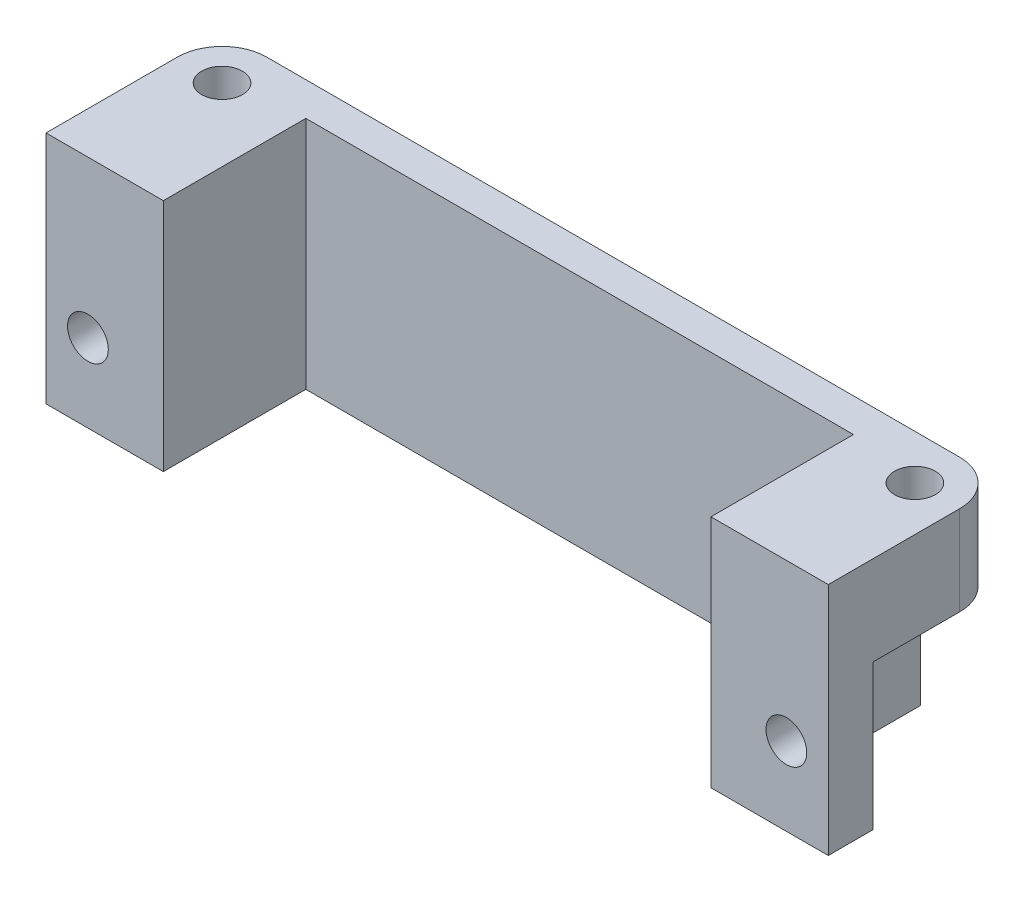
ISO-10303-21;
HEADER;
FILE_DESCRIPTION(('STEP AP214'),'2;1');
FILE_NAME('part.step','',(''),(''),'','','');
FILE_SCHEMA(('AUTOMOTIVE_DESIGN { 1 0 10303 214 1 1 1 1 }'));
ENDSEC;
DATA;
#1=APPLICATION_CONTEXT('core data for automotive mechanical design processes');
#2=APPLICATION_PROTOCOL_DEFINITION('international standard','automotive_design',2000,#1);
#3=PRODUCT_CONTEXT('',#1,'mechanical');
#4=PRODUCT('Part','Part','',(#3));
#5=PRODUCT_RELATED_PRODUCT_CATEGORY('part','',(#4));
#6=PRODUCT_DEFINITION_FORMATION('','',#4);
#7=PRODUCT_DEFINITION_CONTEXT('part definition',#1,'design');
#8=PRODUCT_DEFINITION('design','',#6,#7);
#9=PRODUCT_DEFINITION_SHAPE('','',#8);
#10=(LENGTH_UNIT() NAMED_UNIT(*) SI_UNIT(.MILLI.,.METRE.));
#11=(NAMED_UNIT(*) PLANE_ANGLE_UNIT() SI_UNIT($,.RADIAN.));
#12=(NAMED_UNIT(*) SI_UNIT($,.STERADIAN.) SOLID_ANGLE_UNIT());
#13=UNCERTAINTY_MEASURE_WITH_UNIT(LENGTH_MEASURE(1.E-05),#10,'distance_accuracy_value','');
#14=(GEOMETRIC_REPRESENTATION_CONTEXT(3) GLOBAL_UNCERTAINTY_ASSIGNED_CONTEXT((#13)) GLOBAL_UNIT_ASSIGNED_CONTEXT((#10,
#11,#12)) REPRESENTATION_CONTEXT('',''));
#15=CARTESIAN_POINT('',(0.,0.,0.));
#16=DIRECTION('',(0.,0.,1.));
#17=DIRECTION('',(1.,0.,0.));
#18=AXIS2_PLACEMENT_3D('',#15,#16,#17);
#19=CARTESIAN_POINT('',(0.,21.,-15.75));
#20=DIRECTION('',(0.,0.,1.));
#21=DIRECTION('',(1.,0.,0.));
#22=AXIS2_PLACEMENT_3D('',#19,#20,#21);
#23=PLANE('',#22);
#24=DIRECTION('',(-1.,0.,0.));
#25=VECTOR('',#24,1.);
#26=CARTESIAN_POINT('',(0.,21.,-15.75));
#27=LINE('',#26,#25);
#28=CARTESIAN_POINT('',(31.,21.,-15.75));
#29=VERTEX_POINT('',#28);
#30=CARTESIAN_POINT('',(-31.,21.,-15.75));
#31=VERTEX_POINT('',#30);
#32=EDGE_CURVE('E249',#29,#31,#27,.T.);
#33=ORIENTED_EDGE('',*,*,#32,.F.);
#34=DIRECTION('',(0.,-1.,0.));
#35=VECTOR('',#34,1.);
#36=CARTESIAN_POINT('',(31.,21.,-15.75));
#37=LINE('',#36,#35);
#38=CARTESIAN_POINT('',(31.,13.,-15.7500000000001));
#39=VERTEX_POINT('',#38);
#40=EDGE_CURVE('E279',#29,#39,#37,.T.);
#41=ORIENTED_EDGE('',*,*,#40,.T.);
#42=DIRECTION('',(-1.,0.,0.));
#43=VECTOR('',#42,1.);
#44=CARTESIAN_POINT('',(35.,13.,-15.7500000000001));
#45=LINE('',#44,#43);
#46=CARTESIAN_POINT('',(27.5,13.,-15.7500000000001));
#47=VERTEX_POINT('',#46);
#48=EDGE_CURVE('E167',#39,#47,#45,.T.);
#49=ORIENTED_EDGE('',*,*,#48,.T.);
#50=DIRECTION('',(0.,-1.,0.));
#51=VECTOR('',#50,1.);
#52=CARTESIAN_POINT('',(27.5,13.,-15.7500000000001));
#53=LINE('',#52,#51);
#54=CARTESIAN_POINT('',(27.5,0.,-15.7500000000001));
#55=VERTEX_POINT('',#54);
#56=EDGE_CURVE('E169',#47,#55,#53,.T.);
#57=ORIENTED_EDGE('',*,*,#56,.T.);
#58=DIRECTION('',(-1.,0.,0.));
#59=VECTOR('',#58,1.);
#60=CARTESIAN_POINT('',(0.,0.,-15.75));
#61=LINE('',#60,#59);
#62=CARTESIAN_POINT('',(-27.5,0.,-15.75));
#63=VERTEX_POINT('',#62);
#64=EDGE_CURVE('E241',#55,#63,#61,.T.);
#65=ORIENTED_EDGE('',*,*,#64,.T.);
#66=DIRECTION('',(0.,-1.,0.));
#67=VECTOR('',#66,1.);
#68=CARTESIAN_POINT('',(-27.5,13.,-15.75));
#69=LINE('',#68,#67);
#70=CARTESIAN_POINT('',(-27.5,13.,-15.75));
#71=VERTEX_POINT('',#70);
#72=EDGE_CURVE('E219',#71,#63,#69,.T.);
#73=ORIENTED_EDGE('',*,*,#72,.F.);
#74=DIRECTION('',(1.,0.,0.));
#75=VECTOR('',#74,1.);
#76=CARTESIAN_POINT('',(-35.,13.,-15.75));
#77=LINE('',#76,#75);
#78=CARTESIAN_POINT('',(-31.,13.,-15.75));
#79=VERTEX_POINT('',#78);
#80=EDGE_CURVE('E210',#79,#71,#77,.T.);
#81=ORIENTED_EDGE('',*,*,#80,.F.);
#82=DIRECTION('',(0.,-1.,0.));
#83=VECTOR('',#82,1.);
#84=CARTESIAN_POINT('',(-31.,21.,-15.75));
#85=LINE('',#84,#83);
#86=EDGE_CURVE('E274',#79,#31,#85,.F.);
#87=ORIENTED_EDGE('',*,*,#86,.T.);
#88=EDGE_LOOP('',(#33,#41,#49,#57,#65,#73,#81,#87));
#89=FACE_BOUND('',#88,.T.);
#90=ADVANCED_FACE('F35',(#89),#23,.F.);
#91=CARTESIAN_POINT('',(0.,0.,0.));
#92=DIRECTION('',(0.,1.,0.));
#93=DIRECTION('',(0.,0.,1.));
#94=AXIS2_PLACEMENT_3D('',#91,#92,#93);
#95=PLANE('',#94);
#96=DIRECTION('',(0.,0.,1.));
#97=VECTOR('',#96,1.);
#98=CARTESIAN_POINT('',(27.5,0.,-15.7500000000001));
#99=LINE('',#98,#97);
#100=CARTESIAN_POINT('',(27.5,0.,-4.00000000000006));
#101=VERTEX_POINT('',#100);
#102=EDGE_CURVE('E160',#55,#101,#99,.T.);
#103=ORIENTED_EDGE('',*,*,#102,.T.);
#104=DIRECTION('',(1.,0.,0.));
#105=VECTOR('',#104,1.);
#106=CARTESIAN_POINT('',(35.,0.,-4.00000000000008));
#107=LINE('',#106,#105);
#108=CARTESIAN_POINT('',(35.,0.,-4.00000000000008));
#109=VERTEX_POINT('',#108);
#110=EDGE_CURVE('E292',#101,#109,#107,.T.);
#111=ORIENTED_EDGE('',*,*,#110,.T.);
#112=DIRECTION('',(0.,0.,-1.));
#113=VECTOR('',#112,1.);
#114=CARTESIAN_POINT('',(35.,0.,0.));
#115=LINE('',#114,#113);
#116=CARTESIAN_POINT('',(35.,0.,0.));
#117=VERTEX_POINT('',#116);
#118=EDGE_CURVE('E166',#117,#109,#115,.T.);
#119=ORIENTED_EDGE('',*,*,#118,.F.);
#120=DIRECTION('',(1.,0.,0.));
#121=VECTOR('',#120,1.);
#122=CARTESIAN_POINT('',(0.,0.,0.));
#123=LINE('',#122,#121);
#124=CARTESIAN_POINT('',(24.5,0.,0.));
#125=VERTEX_POINT('',#124);
#126=EDGE_CURVE('E183',#125,#117,#123,.T.);
#127=ORIENTED_EDGE('',*,*,#126,.F.);
#128=DIRECTION('',(0.,0.,-1.));
#129=VECTOR('',#128,1.);
#130=CARTESIAN_POINT('',(24.5,0.,0.));
#131=LINE('',#130,#129);
#132=CARTESIAN_POINT('',(24.5,0.,-12.7500000000001));
#133=VERTEX_POINT('',#132);
#134=EDGE_CURVE('E190',#125,#133,#131,.T.);
#135=ORIENTED_EDGE('',*,*,#134,.T.);
#136=DIRECTION('',(-1.,0.,0.));
#137=VECTOR('',#136,1.);
#138=CARTESIAN_POINT('',(0.,0.,-12.75));
#139=LINE('',#138,#137);
#140=CARTESIAN_POINT('',(-24.5,0.,-12.75));
#141=VERTEX_POINT('',#140);
#142=EDGE_CURVE('E260',#133,#141,#139,.T.);
#143=ORIENTED_EDGE('',*,*,#142,.T.);
#144=DIRECTION('',(0.,0.,-1.));
#145=VECTOR('',#144,1.);
#146=CARTESIAN_POINT('',(-24.5,0.,0.));
#147=LINE('',#146,#145);
#148=CARTESIAN_POINT('',(-24.5,0.,0.));
#149=VERTEX_POINT('',#148);
#150=EDGE_CURVE('E257',#149,#141,#147,.T.);
#151=ORIENTED_EDGE('',*,*,#150,.F.);
#152=DIRECTION('',(-1.,0.,0.));
#153=VECTOR('',#152,1.);
#154=CARTESIAN_POINT('',(0.,0.,0.));
#155=LINE('',#154,#153);
#156=CARTESIAN_POINT('',(-35.,0.,0.));
#157=VERTEX_POINT('',#156);
#158=EDGE_CURVE('E254',#149,#157,#155,.T.);
#159=ORIENTED_EDGE('',*,*,#158,.T.);
#160=DIRECTION('',(0.,0.,-1.));
#161=VECTOR('',#160,1.);
#162=CARTESIAN_POINT('',(-35.,0.,0.));
#163=LINE('',#162,#161);
#164=CARTESIAN_POINT('',(-35.,0.,-4.));
#165=VERTEX_POINT('',#164);
#166=EDGE_CURVE('E236',#157,#165,#163,.T.);
#167=ORIENTED_EDGE('',*,*,#166,.T.);
#168=DIRECTION('',(-1.,0.,0.));
#169=VECTOR('',#168,1.);
#170=CARTESIAN_POINT('',(-35.,0.,-4.));
#171=LINE('',#170,#169);
#172=CARTESIAN_POINT('',(-27.5,0.,-4.));
#173=VERTEX_POINT('',#172);
#174=EDGE_CURVE('E211',#173,#165,#171,.T.);
#175=ORIENTED_EDGE('',*,*,#174,.F.);
#176=DIRECTION('',(0.,0.,1.));
#177=VECTOR('',#176,1.);
#178=CARTESIAN_POINT('',(-27.5,0.,-15.75));
#179=LINE('',#178,#177);
#180=EDGE_CURVE('E204',#63,#173,#179,.T.);
#181=ORIENTED_EDGE('',*,*,#180,.F.);
#182=ORIENTED_EDGE('',*,*,#64,.F.);
#183=EDGE_LOOP('',(#103,#111,#119,#127,#135,#143,#151,#159,#167,#175,#181,#182));
#184=FACE_BOUND('',#183,.T.);
#185=ADVANCED_FACE('F300',(#184),#95,.F.);
#186=CARTESIAN_POINT('',(35.,21.,0.));
#187=DIRECTION('',(-1.,0.,0.));
#188=DIRECTION('',(0.,0.,1.));
#189=AXIS2_PLACEMENT_3D('',#186,#187,#188);
#190=PLANE('',#189);
#191=DIRECTION('',(0.,0.,-1.));
#192=VECTOR('',#191,1.);
#193=CARTESIAN_POINT('',(35.,13.,-15.7500000000001));
#194=LINE('',#193,#192);
#195=CARTESIAN_POINT('',(35.,13.,-4.00000000000008));
#196=VERTEX_POINT('',#195);
#197=CARTESIAN_POINT('',(35.,13.,-11.75));
#198=VERTEX_POINT('',#197);
#199=EDGE_CURVE('E157',#196,#198,#194,.T.);
#200=ORIENTED_EDGE('',*,*,#199,.T.);
#201=DIRECTION('',(0.,-1.,0.));
#202=VECTOR('',#201,1.);
#203=CARTESIAN_POINT('',(35.,21.,-11.75));
#204=LINE('',#203,#202);
#205=CARTESIAN_POINT('',(35.,21.,-11.75));
#206=VERTEX_POINT('',#205);
#207=EDGE_CURVE('E43',#198,#206,#204,.F.);
#208=ORIENTED_EDGE('',*,*,#207,.T.);
#209=DIRECTION('',(0.,0.,-1.));
#210=VECTOR('',#209,1.);
#211=CARTESIAN_POINT('',(35.,21.,0.));
#212=LINE('',#211,#210);
#213=CARTESIAN_POINT('',(35.,21.,0.));
#214=VERTEX_POINT('',#213);
#215=EDGE_CURVE('E180',#214,#206,#212,.T.);
#216=ORIENTED_EDGE('',*,*,#215,.F.);
#217=DIRECTION('',(0.,-1.,0.));
#218=VECTOR('',#217,1.);
#219=CARTESIAN_POINT('',(35.,21.,0.));
#220=LINE('',#219,#218);
#221=EDGE_CURVE('E188',#214,#117,#220,.T.);
#222=ORIENTED_EDGE('',*,*,#221,.T.);
#223=ORIENTED_EDGE('',*,*,#118,.T.);
#224=DIRECTION('',(0.,-1.,0.));
#225=VECTOR('',#224,1.);
#226=CARTESIAN_POINT('',(35.,13.,-4.00000000000008));
#227=LINE('',#226,#225);
#228=EDGE_CURVE('E152',#196,#109,#227,.T.);
#229=ORIENTED_EDGE('',*,*,#228,.F.);
#230=EDGE_LOOP('',(#200,#208,#216,#222,#223,#229));
#231=FACE_BOUND('',#230,.T.);
#232=ADVANCED_FACE('F163',(#231),#190,.F.);
#233=CARTESIAN_POINT('',(-35.,21.,0.));
#234=DIRECTION('',(-1.,0.,0.));
#235=DIRECTION('',(0.,0.,1.));
#236=AXIS2_PLACEMENT_3D('',#233,#234,#235);
#237=PLANE('',#236);
#238=DIRECTION('',(0.,0.,-1.));
#239=VECTOR('',#238,1.);
#240=CARTESIAN_POINT('',(-35.,21.,0.));
#241=LINE('',#240,#239);
#242=CARTESIAN_POINT('',(-35.,21.,0.));
#243=VERTEX_POINT('',#242);
#244=CARTESIAN_POINT('',(-35.,21.,-11.75));
#245=VERTEX_POINT('',#244);
#246=EDGE_CURVE('E237',#243,#245,#241,.T.);
#247=ORIENTED_EDGE('',*,*,#246,.T.);
#248=DIRECTION('',(0.,-1.,0.));
#249=VECTOR('',#248,1.);
#250=CARTESIAN_POINT('',(-35.,13.,-11.75));
#251=LINE('',#250,#249);
#252=CARTESIAN_POINT('',(-35.,13.,-11.75));
#253=VERTEX_POINT('',#252);
#254=EDGE_CURVE('E269',#245,#253,#251,.T.);
#255=ORIENTED_EDGE('',*,*,#254,.T.);
#256=DIRECTION('',(0.,0.,-1.));
#257=VECTOR('',#256,1.);
#258=CARTESIAN_POINT('',(-35.,13.,-15.75));
#259=LINE('',#258,#257);
#260=CARTESIAN_POINT('',(-35.,13.,-4.));
#261=VERTEX_POINT('',#260);
#262=EDGE_CURVE('E207',#261,#253,#259,.T.);
#263=ORIENTED_EDGE('',*,*,#262,.F.);
#264=DIRECTION('',(0.,-1.,0.));
#265=VECTOR('',#264,1.);
#266=CARTESIAN_POINT('',(-35.,13.,-4.));
#267=LINE('',#266,#265);
#268=EDGE_CURVE('E223',#261,#165,#267,.T.);
#269=ORIENTED_EDGE('',*,*,#268,.T.);
#270=ORIENTED_EDGE('',*,*,#166,.F.);
#271=DIRECTION('',(0.,-1.,0.));
#272=VECTOR('',#271,1.);
#273=CARTESIAN_POINT('',(-35.,21.,0.));
#274=LINE('',#273,#272);
#275=EDGE_CURVE('E267',#243,#157,#274,.T.);
#276=ORIENTED_EDGE('',*,*,#275,.F.);
#277=EDGE_LOOP('',(#247,#255,#263,#269,#270,#276));
#278=FACE_BOUND('',#277,.T.);
#279=ADVANCED_FACE('F317',(#278),#237,.T.);
#280=CARTESIAN_POINT('',(0.,21.,0.));
#281=DIRECTION('',(0.,0.,1.));
#282=DIRECTION('',(1.,0.,0.));
#283=AXIS2_PLACEMENT_3D('',#280,#281,#282);
#284=PLANE('',#283);
#285=CARTESIAN_POINT('',(-31.25,7.,0.));
#286=DIRECTION('',(0.,0.,1.));
#287=DIRECTION('',(1.,0.,0.));
#288=AXIS2_PLACEMENT_3D('',#285,#286,#287);
#289=CIRCLE('',#288,1.825);
#290=CARTESIAN_POINT('',(-29.425,7.,0.));
#291=VERTEX_POINT('',#290);
#292=EDGE_CURVE('E233',#291,#291,#289,.T.);
#293=ORIENTED_EDGE('',*,*,#292,.F.);
#294=EDGE_LOOP('',(#293));
#295=FACE_BOUND('',#294,.T.);
#296=ORIENTED_EDGE('',*,*,#158,.F.);
#297=DIRECTION('',(0.,-1.,0.));
#298=VECTOR('',#297,1.);
#299=CARTESIAN_POINT('',(-24.5,21.,0.));
#300=LINE('',#299,#298);
#301=CARTESIAN_POINT('',(-24.5,21.,0.));
#302=VERTEX_POINT('',#301);
#303=EDGE_CURVE('E265',#302,#149,#300,.T.);
#304=ORIENTED_EDGE('',*,*,#303,.F.);
#305=DIRECTION('',(-1.,0.,0.));
#306=VECTOR('',#305,1.);
#307=CARTESIAN_POINT('',(0.,21.,0.));
#308=LINE('',#307,#306);
#309=EDGE_CURVE('E240',#302,#243,#308,.T.);
#310=ORIENTED_EDGE('',*,*,#309,.T.);
#311=ORIENTED_EDGE('',*,*,#275,.T.);
#312=EDGE_LOOP('',(#296,#304,#310,#311));
#313=FACE_BOUND('',#312,.T.);
#314=ADVANCED_FACE('F322',(#295,#313),#284,.T.);
#315=CARTESIAN_POINT('',(-24.5,21.,0.));
#316=DIRECTION('',(-1.,0.,0.));
#317=DIRECTION('',(0.,0.,1.));
#318=AXIS2_PLACEMENT_3D('',#315,#316,#317);
#319=PLANE('',#318);
#320=ORIENTED_EDGE('',*,*,#150,.T.);
#321=DIRECTION('',(0.,-1.,0.));
#322=VECTOR('',#321,1.);
#323=CARTESIAN_POINT('',(-24.5,21.,-12.75));
#324=LINE('',#323,#322);
#325=CARTESIAN_POINT('',(-24.5,21.,-12.75));
#326=VERTEX_POINT('',#325);
#327=EDGE_CURVE('E251',#326,#141,#324,.T.);
#328=ORIENTED_EDGE('',*,*,#327,.F.);
#329=DIRECTION('',(0.,0.,-1.));
#330=VECTOR('',#329,1.);
#331=CARTESIAN_POINT('',(-24.5,21.,0.));
#332=LINE('',#331,#330);
#333=EDGE_CURVE('E244',#302,#326,#332,.T.);
#334=ORIENTED_EDGE('',*,*,#333,.F.);
#335=ORIENTED_EDGE('',*,*,#303,.T.);
#336=EDGE_LOOP('',(#320,#328,#334,#335));
#337=FACE_BOUND('',#336,.T.);
#338=ADVANCED_FACE('F328',(#337),#319,.F.);
#339=CARTESIAN_POINT('',(0.,21.,-12.75));
#340=DIRECTION('',(0.,0.,1.));
#341=DIRECTION('',(1.,0.,0.));
#342=AXIS2_PLACEMENT_3D('',#339,#340,#341);
#343=PLANE('',#342);
#344=ORIENTED_EDGE('',*,*,#142,.F.);
#345=DIRECTION('',(0.,-1.,0.));
#346=VECTOR('',#345,1.);
#347=CARTESIAN_POINT('',(24.5,21.,-12.7500000000001));
#348=LINE('',#347,#346);
#349=CARTESIAN_POINT('',(24.5,21.,-12.7500000000001));
#350=VERTEX_POINT('',#349);
#351=EDGE_CURVE('E197',#350,#133,#348,.T.);
#352=ORIENTED_EDGE('',*,*,#351,.F.);
#353=DIRECTION('',(-1.,0.,0.));
#354=VECTOR('',#353,1.);
#355=CARTESIAN_POINT('',(0.,21.,-12.75));
#356=LINE('',#355,#354);
#357=EDGE_CURVE('E246',#350,#326,#356,.T.);
#358=ORIENTED_EDGE('',*,*,#357,.T.);
#359=ORIENTED_EDGE('',*,*,#327,.T.);
#360=EDGE_LOOP('',(#344,#352,#358,#359));
#361=FACE_BOUND('',#360,.T.);
#362=ADVANCED_FACE('F331',(#361),#343,.T.);
#363=CARTESIAN_POINT('',(0.,21.,0.));
#364=DIRECTION('',(0.,1.,0.));
#365=DIRECTION('',(0.,0.,1.));
#366=AXIS2_PLACEMENT_3D('',#363,#364,#365);
#367=PLANE('',#366);
#368=CARTESIAN_POINT('',(31.,21.,-11.7500000000001));
#369=DIRECTION('',(0.,1.,0.));
#370=DIRECTION('',(0.,0.,-1.));
#371=AXIS2_PLACEMENT_3D('',#368,#369,#370);
#372=CIRCLE('',#371,1.825);
#373=CARTESIAN_POINT('',(31.,21.,-13.5750000000001));
#374=VERTEX_POINT('',#373);
#375=EDGE_CURVE('E294',#374,#374,#372,.T.);
#376=ORIENTED_EDGE('',*,*,#375,.F.);
#377=EDGE_LOOP('',(#376));
#378=FACE_BOUND('',#377,.T.);
#379=CARTESIAN_POINT('',(-31.,21.,-11.75));
#380=DIRECTION('',(0.,-1.,0.));
#381=DIRECTION('',(0.,0.,-1.));
#382=AXIS2_PLACEMENT_3D('',#379,#380,#381);
#383=CIRCLE('',#382,1.825);
#384=CARTESIAN_POINT('',(-31.,21.,-13.575));
#385=VERTEX_POINT('',#384);
#386=EDGE_CURVE('E201',#385,#385,#383,.T.);
#387=ORIENTED_EDGE('',*,*,#386,.T.);
#388=EDGE_LOOP('',(#387));
#389=FACE_BOUND('',#388,.T.);
#390=ORIENTED_EDGE('',*,*,#215,.T.);
#391=CARTESIAN_POINT('',(31.,21.,-11.75));
#392=DIRECTION('',(0.,1.,0.));
#393=DIRECTION('',(0.,0.,1.));
#394=AXIS2_PLACEMENT_3D('',#391,#392,#393);
#395=CIRCLE('',#394,4.);
#396=EDGE_CURVE('E11',#206,#29,#395,.T.);
#397=ORIENTED_EDGE('',*,*,#396,.T.);
#398=ORIENTED_EDGE('',*,*,#32,.T.);
#399=CARTESIAN_POINT('',(-31.,21.,-11.75));
#400=DIRECTION('',(0.,1.,0.));
#401=DIRECTION('',(0.,0.,1.));
#402=AXIS2_PLACEMENT_3D('',#399,#400,#401);
#403=CIRCLE('',#402,4.);
#404=EDGE_CURVE('E277',#31,#245,#403,.T.);
#405=ORIENTED_EDGE('',*,*,#404,.T.);
#406=ORIENTED_EDGE('',*,*,#246,.F.);
#407=ORIENTED_EDGE('',*,*,#309,.F.);
#408=ORIENTED_EDGE('',*,*,#333,.T.);
#409=ORIENTED_EDGE('',*,*,#357,.F.);
#410=DIRECTION('',(0.,0.,-1.));
#411=VECTOR('',#410,1.);
#412=CARTESIAN_POINT('',(24.5,21.,0.));
#413=LINE('',#412,#411);
#414=CARTESIAN_POINT('',(24.5,21.,0.));
#415=VERTEX_POINT('',#414);
#416=EDGE_CURVE('E182',#415,#350,#413,.T.);
#417=ORIENTED_EDGE('',*,*,#416,.F.);
#418=DIRECTION('',(1.,0.,0.));
#419=VECTOR('',#418,1.);
#420=CARTESIAN_POINT('',(0.,21.,0.));
#421=LINE('',#420,#419);
#422=EDGE_CURVE('E186',#415,#214,#421,.T.);
#423=ORIENTED_EDGE('',*,*,#422,.T.);
#424=EDGE_LOOP('',(#390,#397,#398,#405,#406,#407,#408,#409,#417,#423));
#425=FACE_BOUND('',#424,.T.);
#426=ADVANCED_FACE('F314',(#378,#389,#425),#367,.T.);
#427=CARTESIAN_POINT('',(-31.25,7.,-4.));
#428=DIRECTION('',(0.,0.,1.));
#429=DIRECTION('',(1.,0.,0.));
#430=AXIS2_PLACEMENT_3D('',#427,#428,#429);
#431=CYLINDRICAL_SURFACE('',#430,1.825);
#432=CARTESIAN_POINT('',(-31.25,7.,-4.));
#433=DIRECTION('',(0.,0.,1.));
#434=DIRECTION('',(1.,0.,0.));
#435=AXIS2_PLACEMENT_3D('',#432,#433,#434);
#436=CIRCLE('',#435,1.825);
#437=CARTESIAN_POINT('',(-29.425,7.,-4.));
#438=VERTEX_POINT('',#437);
#439=EDGE_CURVE('E226',#438,#438,#436,.T.);
#440=ORIENTED_EDGE('',*,*,#439,.F.);
#441=EDGE_LOOP('',(#440));
#442=FACE_BOUND('',#441,.T.);
#443=ORIENTED_EDGE('',*,*,#292,.T.);
#444=EDGE_LOOP('',(#443));
#445=FACE_BOUND('',#444,.T.);
#446=ADVANCED_FACE('F388',(#442,#445),#431,.F.);
#447=CARTESIAN_POINT('',(-35.,13.,-4.));
#448=DIRECTION('',(0.,0.,1.));
#449=DIRECTION('',(1.,0.,0.));
#450=AXIS2_PLACEMENT_3D('',#447,#448,#449);
#451=PLANE('',#450);
#452=ORIENTED_EDGE('',*,*,#439,.T.);
#453=EDGE_LOOP('',(#452));
#454=FACE_BOUND('',#453,.T.);
#455=ORIENTED_EDGE('',*,*,#174,.T.);
#456=ORIENTED_EDGE('',*,*,#268,.F.);
#457=DIRECTION('',(-1.,0.,0.));
#458=VECTOR('',#457,1.);
#459=CARTESIAN_POINT('',(-35.,13.,-4.));
#460=LINE('',#459,#458);
#461=CARTESIAN_POINT('',(-27.5,13.,-4.));
#462=VERTEX_POINT('',#461);
#463=EDGE_CURVE('E216',#462,#261,#460,.T.);
#464=ORIENTED_EDGE('',*,*,#463,.F.);
#465=DIRECTION('',(0.,-1.,0.));
#466=VECTOR('',#465,1.);
#467=CARTESIAN_POINT('',(-27.5,13.,-4.));
#468=LINE('',#467,#466);
#469=EDGE_CURVE('E227',#462,#173,#468,.T.);
#470=ORIENTED_EDGE('',*,*,#469,.T.);
#471=EDGE_LOOP('',(#455,#456,#464,#470));
#472=FACE_BOUND('',#471,.T.);
#473=ADVANCED_FACE('F382',(#454,#472),#451,.F.);
#474=CARTESIAN_POINT('',(-27.5,13.,-15.75));
#475=DIRECTION('',(1.,0.,0.));
#476=DIRECTION('',(0.,0.,-1.));
#477=AXIS2_PLACEMENT_3D('',#474,#475,#476);
#478=PLANE('',#477);
#479=ORIENTED_EDGE('',*,*,#180,.T.);
#480=ORIENTED_EDGE('',*,*,#469,.F.);
#481=DIRECTION('',(0.,0.,1.));
#482=VECTOR('',#481,1.);
#483=CARTESIAN_POINT('',(-27.5,13.,-15.75));
#484=LINE('',#483,#482);
#485=EDGE_CURVE('E213',#71,#462,#484,.T.);
#486=ORIENTED_EDGE('',*,*,#485,.F.);
#487=ORIENTED_EDGE('',*,*,#72,.T.);
#488=EDGE_LOOP('',(#479,#480,#486,#487));
#489=FACE_BOUND('',#488,.T.);
#490=ADVANCED_FACE('F303',(#489),#478,.F.);
#491=CARTESIAN_POINT('',(0.,13.,0.));
#492=DIRECTION('',(0.,1.,0.));
#493=DIRECTION('',(0.,0.,1.));
#494=AXIS2_PLACEMENT_3D('',#491,#492,#493);
#495=PLANE('',#494);
#496=CARTESIAN_POINT('',(-31.,13.,-11.75));
#497=DIRECTION('',(0.,-1.,0.));
#498=DIRECTION('',(0.,0.,-1.));
#499=AXIS2_PLACEMENT_3D('',#496,#497,#498);
#500=CIRCLE('',#499,1.825);
#501=CARTESIAN_POINT('',(-31.,13.,-13.575));
#502=VERTEX_POINT('',#501);
#503=EDGE_CURVE('E200',#502,#502,#500,.T.);
#504=ORIENTED_EDGE('',*,*,#503,.F.);
#505=EDGE_LOOP('',(#504));
#506=FACE_BOUND('',#505,.T.);
#507=ORIENTED_EDGE('',*,*,#262,.T.);
#508=CARTESIAN_POINT('',(-31.,13.,-11.75));
#509=DIRECTION('',(0.,1.,0.));
#510=DIRECTION('',(0.,0.,1.));
#511=AXIS2_PLACEMENT_3D('',#508,#509,#510);
#512=CIRCLE('',#511,4.);
#513=EDGE_CURVE('E272',#253,#79,#512,.F.);
#514=ORIENTED_EDGE('',*,*,#513,.T.);
#515=ORIENTED_EDGE('',*,*,#80,.T.);
#516=ORIENTED_EDGE('',*,*,#485,.T.);
#517=ORIENTED_EDGE('',*,*,#463,.T.);
#518=EDGE_LOOP('',(#507,#514,#515,#516,#517));
#519=FACE_BOUND('',#518,.T.);
#520=ADVANCED_FACE('F370',(#506,#519),#495,.F.);
#521=CARTESIAN_POINT('',(-31.,21.,-11.75));
#522=DIRECTION('',(0.,1.,0.));
#523=DIRECTION('',(0.,0.,1.));
#524=AXIS2_PLACEMENT_3D('',#521,#522,#523);
#525=CYLINDRICAL_SURFACE('',#524,4.);
#526=ORIENTED_EDGE('',*,*,#404,.F.);
#527=ORIENTED_EDGE('',*,*,#86,.F.);
#528=ORIENTED_EDGE('',*,*,#513,.F.);
#529=ORIENTED_EDGE('',*,*,#254,.F.);
#530=EDGE_LOOP('',(#526,#527,#528,#529));
#531=FACE_BOUND('',#530,.T.);
#532=ADVANCED_FACE('F310',(#531),#525,.T.);
#533=CARTESIAN_POINT('',(-31.,21.,-11.75));
#534=DIRECTION('',(0.,-1.,0.));
#535=DIRECTION('',(0.,0.,-1.));
#536=AXIS2_PLACEMENT_3D('',#533,#534,#535);
#537=CYLINDRICAL_SURFACE('',#536,1.825);
#538=ORIENTED_EDGE('',*,*,#386,.F.);
#539=EDGE_LOOP('',(#538));
#540=FACE_BOUND('',#539,.T.);
#541=ORIENTED_EDGE('',*,*,#503,.T.);
#542=EDGE_LOOP('',(#541));
#543=FACE_BOUND('',#542,.T.);
#544=ADVANCED_FACE('F351',(#540,#543),#537,.F.);
#545=CARTESIAN_POINT('',(24.5,21.,0.));
#546=DIRECTION('',(-1.,0.,0.));
#547=DIRECTION('',(0.,0.,1.));
#548=AXIS2_PLACEMENT_3D('',#545,#546,#547);
#549=PLANE('',#548);
#550=ORIENTED_EDGE('',*,*,#134,.F.);
#551=DIRECTION('',(0.,-1.,0.));
#552=VECTOR('',#551,1.);
#553=CARTESIAN_POINT('',(24.5,21.,0.));
#554=LINE('',#553,#552);
#555=EDGE_CURVE('E195',#415,#125,#554,.T.);
#556=ORIENTED_EDGE('',*,*,#555,.F.);
#557=ORIENTED_EDGE('',*,*,#416,.T.);
#558=ORIENTED_EDGE('',*,*,#351,.T.);
#559=EDGE_LOOP('',(#550,#556,#557,#558));
#560=FACE_BOUND('',#559,.T.);
#561=ADVANCED_FACE('F334',(#560),#549,.T.);
#562=CARTESIAN_POINT('',(0.,21.,0.));
#563=DIRECTION('',(0.,0.,-1.));
#564=DIRECTION('',(-1.,0.,0.));
#565=AXIS2_PLACEMENT_3D('',#562,#563,#564);
#566=PLANE('',#565);
#567=CARTESIAN_POINT('',(31.25,7.,0.));
#568=DIRECTION('',(0.,0.,-1.));
#569=DIRECTION('',(-1.,0.,0.));
#570=AXIS2_PLACEMENT_3D('',#567,#568,#569);
#571=CIRCLE('',#570,1.825);
#572=CARTESIAN_POINT('',(29.425,7.,0.));
#573=VERTEX_POINT('',#572);
#574=EDGE_CURVE('E177',#573,#573,#571,.T.);
#575=ORIENTED_EDGE('',*,*,#574,.T.);
#576=EDGE_LOOP('',(#575));
#577=FACE_BOUND('',#576,.T.);
#578=ORIENTED_EDGE('',*,*,#126,.T.);
#579=ORIENTED_EDGE('',*,*,#221,.F.);
#580=ORIENTED_EDGE('',*,*,#422,.F.);
#581=ORIENTED_EDGE('',*,*,#555,.T.);
#582=EDGE_LOOP('',(#578,#579,#580,#581));
#583=FACE_BOUND('',#582,.T.);
#584=ADVANCED_FACE('F338',(#577,#583),#566,.F.);
#585=CARTESIAN_POINT('',(31.25,7.,-4.00000000000007));
#586=DIRECTION('',(0.,0.,1.));
#587=DIRECTION('',(1.,0.,0.));
#588=AXIS2_PLACEMENT_3D('',#585,#586,#587);
#589=CYLINDRICAL_SURFACE('',#588,1.825);
#590=CARTESIAN_POINT('',(31.25,7.,-4.00000000000007));
#591=DIRECTION('',(0.,0.,-1.));
#592=DIRECTION('',(-1.,0.,0.));
#593=AXIS2_PLACEMENT_3D('',#590,#591,#592);
#594=CIRCLE('',#593,1.825);
#595=CARTESIAN_POINT('',(29.425,7.,-4.00000000000007));
#596=VERTEX_POINT('',#595);
#597=EDGE_CURVE('E174',#596,#596,#594,.T.);
#598=ORIENTED_EDGE('',*,*,#597,.T.);
#599=EDGE_LOOP('',(#598));
#600=FACE_BOUND('',#599,.T.);
#601=ORIENTED_EDGE('',*,*,#574,.F.);
#602=EDGE_LOOP('',(#601));
#603=FACE_BOUND('',#602,.T.);
#604=ADVANCED_FACE('F341',(#600,#603),#589,.F.);
#605=CARTESIAN_POINT('',(27.5,13.,-15.7500000000001));
#606=DIRECTION('',(1.,0.,0.));
#607=DIRECTION('',(0.,0.,-1.));
#608=AXIS2_PLACEMENT_3D('',#605,#606,#607);
#609=PLANE('',#608);
#610=ORIENTED_EDGE('',*,*,#102,.F.);
#611=ORIENTED_EDGE('',*,*,#56,.F.);
#612=DIRECTION('',(0.,0.,1.));
#613=VECTOR('',#612,1.);
#614=CARTESIAN_POINT('',(27.5,13.,-15.7500000000001));
#615=LINE('',#614,#613);
#616=CARTESIAN_POINT('',(27.5,13.,-4.00000000000006));
#617=VERTEX_POINT('',#616);
#618=EDGE_CURVE('E156',#47,#617,#615,.T.);
#619=ORIENTED_EDGE('',*,*,#618,.T.);
#620=DIRECTION('',(0.,-1.,0.));
#621=VECTOR('',#620,1.);
#622=CARTESIAN_POINT('',(27.5,13.,-4.00000000000006));
#623=LINE('',#622,#621);
#624=EDGE_CURVE('E154',#617,#101,#623,.T.);
#625=ORIENTED_EDGE('',*,*,#624,.T.);
#626=EDGE_LOOP('',(#610,#611,#619,#625));
#627=FACE_BOUND('',#626,.T.);
#628=ADVANCED_FACE('F348',(#627),#609,.T.);
#629=CARTESIAN_POINT('',(35.,13.,-4.00000000000008));
#630=DIRECTION('',(0.,0.,-1.));
#631=DIRECTION('',(-1.,0.,0.));
#632=AXIS2_PLACEMENT_3D('',#629,#630,#631);
#633=PLANE('',#632);
#634=ORIENTED_EDGE('',*,*,#597,.F.);
#635=EDGE_LOOP('',(#634));
#636=FACE_BOUND('',#635,.T.);
#637=ORIENTED_EDGE('',*,*,#110,.F.);
#638=ORIENTED_EDGE('',*,*,#624,.F.);
#639=DIRECTION('',(1.,0.,0.));
#640=VECTOR('',#639,1.);
#641=CARTESIAN_POINT('',(35.,13.,-4.00000000000008));
#642=LINE('',#641,#640);
#643=EDGE_CURVE('E148',#617,#196,#642,.T.);
#644=ORIENTED_EDGE('',*,*,#643,.T.);
#645=ORIENTED_EDGE('',*,*,#228,.T.);
#646=EDGE_LOOP('',(#637,#638,#644,#645));
#647=FACE_BOUND('',#646,.T.);
#648=ADVANCED_FACE('F150',(#636,#647),#633,.T.);
#649=CARTESIAN_POINT('',(0.,13.,0.));
#650=DIRECTION('',(0.,1.,0.));
#651=DIRECTION('',(0.,0.,1.));
#652=AXIS2_PLACEMENT_3D('',#649,#650,#651);
#653=PLANE('',#652);
#654=CARTESIAN_POINT('',(31.,13.,-11.7500000000001));
#655=DIRECTION('',(0.,1.,0.));
#656=DIRECTION('',(0.,0.,-1.));
#657=AXIS2_PLACEMENT_3D('',#654,#655,#656);
#658=CIRCLE('',#657,1.825);
#659=CARTESIAN_POINT('',(31.,13.,-13.5750000000001));
#660=VERTEX_POINT('',#659);
#661=EDGE_CURVE('E403',#660,#660,#658,.T.);
#662=ORIENTED_EDGE('',*,*,#661,.T.);
#663=EDGE_LOOP('',(#662));
#664=FACE_BOUND('',#663,.T.);
#665=ORIENTED_EDGE('',*,*,#48,.F.);
#666=CARTESIAN_POINT('',(31.,13.,-11.75));
#667=DIRECTION('',(0.,1.,0.));
#668=DIRECTION('',(0.,0.,1.));
#669=AXIS2_PLACEMENT_3D('',#666,#667,#668);
#670=CIRCLE('',#669,4.);
#671=EDGE_CURVE('E57',#39,#198,#670,.F.);
#672=ORIENTED_EDGE('',*,*,#671,.T.);
#673=ORIENTED_EDGE('',*,*,#199,.F.);
#674=ORIENTED_EDGE('',*,*,#643,.F.);
#675=ORIENTED_EDGE('',*,*,#618,.F.);
#676=EDGE_LOOP('',(#665,#672,#673,#674,#675));
#677=FACE_BOUND('',#676,.T.);
#678=ADVANCED_FACE('F159',(#664,#677),#653,.F.);
#679=CARTESIAN_POINT('',(31.,21.,-11.75));
#680=DIRECTION('',(0.,-1.,0.));
#681=DIRECTION('',(0.,0.,-1.));
#682=AXIS2_PLACEMENT_3D('',#679,#680,#681);
#683=CYLINDRICAL_SURFACE('',#682,4.);
#684=ORIENTED_EDGE('',*,*,#396,.F.);
#685=ORIENTED_EDGE('',*,*,#207,.F.);
#686=ORIENTED_EDGE('',*,*,#671,.F.);
#687=ORIENTED_EDGE('',*,*,#40,.F.);
#688=EDGE_LOOP('',(#684,#685,#686,#687));
#689=FACE_BOUND('',#688,.T.);
#690=ADVANCED_FACE('F37',(#689),#683,.T.);
#691=CARTESIAN_POINT('',(31.,21.,-11.7500000000001));
#692=DIRECTION('',(0.,-1.,0.));
#693=DIRECTION('',(0.,0.,-1.));
#694=AXIS2_PLACEMENT_3D('',#691,#692,#693);
#695=CYLINDRICAL_SURFACE('',#694,1.825);
#696=ORIENTED_EDGE('',*,*,#375,.T.);
#697=EDGE_LOOP('',(#696));
#698=FACE_BOUND('',#697,.T.);
#699=ORIENTED_EDGE('',*,*,#661,.F.);
#700=EDGE_LOOP('',(#699));
#701=FACE_BOUND('',#700,.T.);
#702=ADVANCED_FACE('F410',(#698,#701),#695,.F.);
#703=CLOSED_SHELL('',(#90,#185,#232,#279,#314,#338,#362,#426,#446,#473,#490,#520,#532,#544,#561,
#584,#604,#628,#648,#678,#690,#702));
#704=MANIFOLD_SOLID_BREP('B2',#703);
#705=ADVANCED_BREP_SHAPE_REPRESENTATION('',(#18,#704),#14);
#706=SHAPE_DEFINITION_REPRESENTATION(#9,#705);
ENDSEC;
END-ISO-10303-21;
